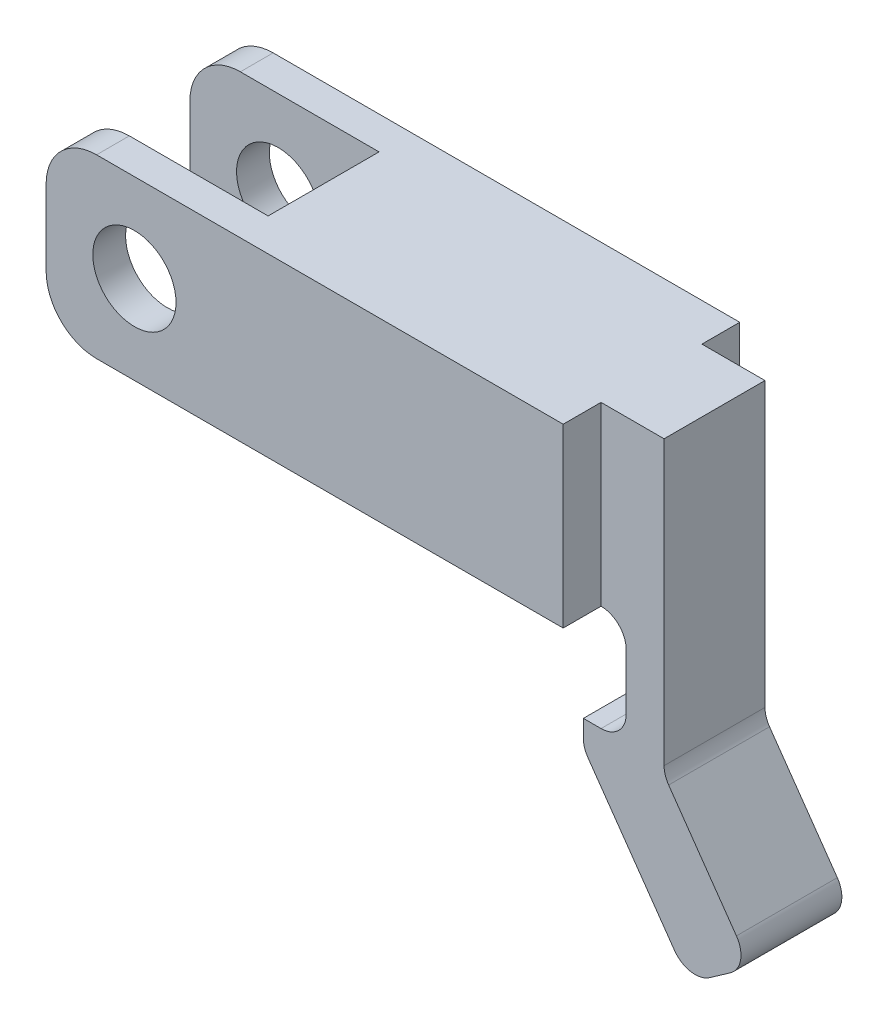
ISO-10303-21;
HEADER;
FILE_DESCRIPTION(('STEP AP214'),'2;1');
FILE_NAME('part.step','',(''),(''),'','','');
FILE_SCHEMA(('AUTOMOTIVE_DESIGN { 1 0 10303 214 1 1 1 1 }'));
ENDSEC;
DATA;
#1=APPLICATION_CONTEXT('core data for automotive mechanical design processes');
#2=APPLICATION_PROTOCOL_DEFINITION('international standard','automotive_design',2000,#1);
#3=PRODUCT_CONTEXT('',#1,'mechanical');
#4=PRODUCT('Part','Part','',(#3));
#5=PRODUCT_RELATED_PRODUCT_CATEGORY('part','',(#4));
#6=PRODUCT_DEFINITION_FORMATION('','',#4);
#7=PRODUCT_DEFINITION_CONTEXT('part definition',#1,'design');
#8=PRODUCT_DEFINITION('design','',#6,#7);
#9=PRODUCT_DEFINITION_SHAPE('','',#8);
#10=(LENGTH_UNIT() NAMED_UNIT(*) SI_UNIT(.MILLI.,.METRE.));
#11=(NAMED_UNIT(*) PLANE_ANGLE_UNIT() SI_UNIT($,.RADIAN.));
#12=(NAMED_UNIT(*) SI_UNIT($,.STERADIAN.) SOLID_ANGLE_UNIT());
#13=UNCERTAINTY_MEASURE_WITH_UNIT(LENGTH_MEASURE(1.E-05),#10,'distance_accuracy_value','');
#14=(GEOMETRIC_REPRESENTATION_CONTEXT(3) GLOBAL_UNCERTAINTY_ASSIGNED_CONTEXT((#13)) GLOBAL_UNIT_ASSIGNED_CONTEXT((#10,
#11,#12)) REPRESENTATION_CONTEXT('',''));
#15=CARTESIAN_POINT('',(0.,0.,0.));
#16=DIRECTION('',(0.,0.,1.));
#17=DIRECTION('',(1.,0.,0.));
#18=AXIS2_PLACEMENT_3D('',#15,#16,#17);
#19=CARTESIAN_POINT('',(6.5,3.5,3.5));
#20=DIRECTION('',(-1.,0.,0.));
#21=DIRECTION('',(0.,0.,1.));
#22=AXIS2_PLACEMENT_3D('',#19,#20,#21);
#23=PLANE('',#22);
#24=DIRECTION('',(0.,-1.,0.));
#25=VECTOR('',#24,1.);
#26=CARTESIAN_POINT('',(6.5,-3.5,2.));
#27=LINE('',#26,#25);
#28=CARTESIAN_POINT('',(6.5,3.5,2.));
#29=VERTEX_POINT('',#28);
#30=CARTESIAN_POINT('',(6.5,-3.5,2.));
#31=VERTEX_POINT('',#30);
#32=EDGE_CURVE('E283',#29,#31,#27,.T.);
#33=ORIENTED_EDGE('',*,*,#32,.F.);
#34=DIRECTION('',(0.,0.,-1.));
#35=VECTOR('',#34,1.);
#36=CARTESIAN_POINT('',(6.5,3.5,3.5));
#37=LINE('',#36,#35);
#38=CARTESIAN_POINT('',(6.5,3.5,3.5));
#39=VERTEX_POINT('',#38);
#40=EDGE_CURVE('E348',#39,#29,#37,.T.);
#41=ORIENTED_EDGE('',*,*,#40,.F.);
#42=DIRECTION('',(0.,1.,0.));
#43=VECTOR('',#42,1.);
#44=CARTESIAN_POINT('',(6.5,3.5,3.5));
#45=LINE('',#44,#43);
#46=CARTESIAN_POINT('',(6.5,-3.5,3.5));
#47=VERTEX_POINT('',#46);
#48=EDGE_CURVE('E324',#47,#39,#45,.T.);
#49=ORIENTED_EDGE('',*,*,#48,.F.);
#50=DIRECTION('',(0.,0.,-1.));
#51=VECTOR('',#50,1.);
#52=CARTESIAN_POINT('',(6.5,-3.5,3.5));
#53=LINE('',#52,#51);
#54=EDGE_CURVE('E341',#47,#31,#53,.T.);
#55=ORIENTED_EDGE('',*,*,#54,.T.);
#56=EDGE_LOOP('',(#33,#41,#49,#55));
#57=FACE_BOUND('',#56,.T.);
#58=ADVANCED_FACE('F33',(#57),#23,.F.);
#59=CARTESIAN_POINT('',(6.5,3.5,-2.));
#60=VERTEX_POINT('',#59);
#61=CARTESIAN_POINT('',(6.5,3.5,-3.5));
#62=VERTEX_POINT('',#61);
#63=EDGE_CURVE('E347',#60,#62,#37,.T.);
#64=ORIENTED_EDGE('',*,*,#63,.F.);
#65=DIRECTION('',(0.,-1.,0.));
#66=VECTOR('',#65,1.);
#67=CARTESIAN_POINT('',(6.5,-3.5,-2.));
#68=LINE('',#67,#66);
#69=CARTESIAN_POINT('',(6.5,-3.5,-2.));
#70=VERTEX_POINT('',#69);
#71=EDGE_CURVE('E261',#60,#70,#68,.T.);
#72=ORIENTED_EDGE('',*,*,#71,.T.);
#73=CARTESIAN_POINT('',(6.5,-3.5,-3.5));
#74=VERTEX_POINT('',#73);
#75=EDGE_CURVE('E333',#70,#74,#53,.T.);
#76=ORIENTED_EDGE('',*,*,#75,.T.);
#77=DIRECTION('',(0.,1.,0.));
#78=VECTOR('',#77,1.);
#79=CARTESIAN_POINT('',(6.5,3.5,-3.5));
#80=LINE('',#79,#78);
#81=EDGE_CURVE('E321',#74,#62,#80,.T.);
#82=ORIENTED_EDGE('',*,*,#81,.T.);
#83=EDGE_LOOP('',(#64,#72,#76,#82));
#84=FACE_BOUND('',#83,.T.);
#85=ADVANCED_FACE('F498',(#84),#23,.F.);
#86=CARTESIAN_POINT('',(-6.5,3.5,3.5));
#87=DIRECTION('',(0.,-1.,0.));
#88=DIRECTION('',(0.,0.,-1.));
#89=AXIS2_PLACEMENT_3D('',#86,#87,#88);
#90=PLANE('',#89);
#91=DIRECTION('',(-1.,0.,0.));
#92=VECTOR('',#91,1.);
#93=CARTESIAN_POINT('',(-6.5,3.5,2.2));
#94=LINE('',#93,#92);
#95=CARTESIAN_POINT('',(-6.5,3.5,2.2));
#96=VERTEX_POINT('',#95);
#97=CARTESIAN_POINT('',(-12.,3.5,2.2));
#98=VERTEX_POINT('',#97);
#99=EDGE_CURVE('E313',#96,#98,#94,.T.);
#100=ORIENTED_EDGE('',*,*,#99,.T.);
#101=DIRECTION('',(0.,0.,1.));
#102=VECTOR('',#101,1.);
#103=CARTESIAN_POINT('',(-12.,3.5,3.5));
#104=LINE('',#103,#102);
#105=CARTESIAN_POINT('',(-12.,3.5,3.5));
#106=VERTEX_POINT('',#105);
#107=EDGE_CURVE('E394',#98,#106,#104,.T.);
#108=ORIENTED_EDGE('',*,*,#107,.T.);
#109=DIRECTION('',(-1.,0.,0.));
#110=VECTOR('',#109,1.);
#111=CARTESIAN_POINT('',(-6.5,3.5,3.5));
#112=LINE('',#111,#110);
#113=EDGE_CURVE('E327',#39,#106,#112,.T.);
#114=ORIENTED_EDGE('',*,*,#113,.F.);
#115=ORIENTED_EDGE('',*,*,#40,.T.);
#116=DIRECTION('',(-1.,0.,0.));
#117=VECTOR('',#116,1.);
#118=CARTESIAN_POINT('',(6.5,3.5,2.));
#119=LINE('',#118,#117);
#120=CARTESIAN_POINT('',(9.,3.5,2.));
#121=VERTEX_POINT('',#120);
#122=EDGE_CURVE('E258',#121,#29,#119,.T.);
#123=ORIENTED_EDGE('',*,*,#122,.F.);
#124=DIRECTION('',(0.,0.,-1.));
#125=VECTOR('',#124,1.);
#126=CARTESIAN_POINT('',(9.,3.5,2.));
#127=LINE('',#126,#125);
#128=CARTESIAN_POINT('',(9.,3.5,-2.));
#129=VERTEX_POINT('',#128);
#130=EDGE_CURVE('E240',#121,#129,#127,.T.);
#131=ORIENTED_EDGE('',*,*,#130,.T.);
#132=DIRECTION('',(-1.,0.,0.));
#133=VECTOR('',#132,1.);
#134=CARTESIAN_POINT('',(6.5,3.5,-2.));
#135=LINE('',#134,#133);
#136=EDGE_CURVE('E280',#129,#60,#135,.T.);
#137=ORIENTED_EDGE('',*,*,#136,.T.);
#138=ORIENTED_EDGE('',*,*,#63,.T.);
#139=DIRECTION('',(-1.,0.,0.));
#140=VECTOR('',#139,1.);
#141=CARTESIAN_POINT('',(-6.5,3.5,-3.5));
#142=LINE('',#141,#140);
#143=CARTESIAN_POINT('',(-12.,3.5,-3.5));
#144=VERTEX_POINT('',#143);
#145=EDGE_CURVE('E336',#62,#144,#142,.T.);
#146=ORIENTED_EDGE('',*,*,#145,.T.);
#147=DIRECTION('',(0.,0.,-1.));
#148=VECTOR('',#147,1.);
#149=CARTESIAN_POINT('',(-12.,3.5,3.5));
#150=LINE('',#149,#148);
#151=CARTESIAN_POINT('',(-12.,3.5,-2.2));
#152=VERTEX_POINT('',#151);
#153=EDGE_CURVE('E392',#144,#152,#150,.F.);
#154=ORIENTED_EDGE('',*,*,#153,.T.);
#155=DIRECTION('',(-1.,0.,0.));
#156=VECTOR('',#155,1.);
#157=CARTESIAN_POINT('',(-6.5,3.5,-2.2));
#158=LINE('',#157,#156);
#159=CARTESIAN_POINT('',(-6.5,3.5,-2.2));
#160=VERTEX_POINT('',#159);
#161=EDGE_CURVE('E299',#160,#152,#158,.T.);
#162=ORIENTED_EDGE('',*,*,#161,.F.);
#163=DIRECTION('',(0.,0.,-1.));
#164=VECTOR('',#163,1.);
#165=CARTESIAN_POINT('',(-6.5,3.5,3.5));
#166=LINE('',#165,#164);
#167=EDGE_CURVE('E344',#96,#160,#166,.T.);
#168=ORIENTED_EDGE('',*,*,#167,.F.);
#169=EDGE_LOOP('',(#100,#108,#114,#115,#123,#131,#137,#138,#146,#154,#162,#168));
#170=FACE_BOUND('',#169,.T.);
#171=ADVANCED_FACE('F459',(#170),#90,.F.);
#172=CARTESIAN_POINT('',(-6.5,3.5,3.5));
#173=DIRECTION('',(1.,0.,0.));
#174=DIRECTION('',(0.,0.,-1.));
#175=AXIS2_PLACEMENT_3D('',#172,#173,#174);
#176=PLANE('',#175);
#177=DIRECTION('',(0.,1.,0.));
#178=VECTOR('',#177,1.);
#179=CARTESIAN_POINT('',(-6.5,3.5,-2.2));
#180=LINE('',#179,#178);
#181=CARTESIAN_POINT('',(-6.5,-2.8,-2.2));
#182=VERTEX_POINT('',#181);
#183=EDGE_CURVE('E292',#182,#160,#180,.T.);
#184=ORIENTED_EDGE('',*,*,#183,.F.);
#185=DIRECTION('',(0.,0.,-1.));
#186=VECTOR('',#185,1.);
#187=CARTESIAN_POINT('',(-6.5,-2.8,3.5));
#188=LINE('',#187,#186);
#189=CARTESIAN_POINT('',(-6.5,-2.8,2.2));
#190=VERTEX_POINT('',#189);
#191=EDGE_CURVE('E354',#182,#190,#188,.F.);
#192=ORIENTED_EDGE('',*,*,#191,.T.);
#193=DIRECTION('',(0.,1.,0.));
#194=VECTOR('',#193,1.);
#195=CARTESIAN_POINT('',(-6.5,3.5,2.2));
#196=LINE('',#195,#194);
#197=EDGE_CURVE('E311',#190,#96,#196,.T.);
#198=ORIENTED_EDGE('',*,*,#197,.T.);
#199=ORIENTED_EDGE('',*,*,#167,.T.);
#200=EDGE_LOOP('',(#184,#192,#198,#199));
#201=FACE_BOUND('',#200,.T.);
#202=ADVANCED_FACE('F641',(#201),#176,.F.);
#203=CARTESIAN_POINT('',(-6.5,-3.5,3.5));
#204=DIRECTION('',(0.,1.,0.));
#205=DIRECTION('',(0.,0.,1.));
#206=AXIS2_PLACEMENT_3D('',#203,#204,#205);
#207=PLANE('',#206);
#208=ORIENTED_EDGE('',*,*,#75,.F.);
#209=DIRECTION('',(0.,0.,-1.));
#210=VECTOR('',#209,1.);
#211=CARTESIAN_POINT('',(6.5,-3.5,2.));
#212=LINE('',#211,#210);
#213=EDGE_CURVE('E402',#70,#31,#212,.F.);
#214=ORIENTED_EDGE('',*,*,#213,.T.);
#215=ORIENTED_EDGE('',*,*,#54,.F.);
#216=DIRECTION('',(1.,0.,0.));
#217=VECTOR('',#216,1.);
#218=CARTESIAN_POINT('',(-6.5,-3.5,3.5));
#219=LINE('',#218,#217);
#220=CARTESIAN_POINT('',(-12.,-3.5,3.5));
#221=VERTEX_POINT('',#220);
#222=EDGE_CURVE('E331',#221,#47,#219,.T.);
#223=ORIENTED_EDGE('',*,*,#222,.F.);
#224=DIRECTION('',(0.,0.,1.));
#225=VECTOR('',#224,1.);
#226=CARTESIAN_POINT('',(-12.,-3.5,2.2));
#227=LINE('',#226,#225);
#228=CARTESIAN_POINT('',(-12.,-3.5,2.2));
#229=VERTEX_POINT('',#228);
#230=EDGE_CURVE('E373',#221,#229,#227,.F.);
#231=ORIENTED_EDGE('',*,*,#230,.T.);
#232=DIRECTION('',(1.,0.,0.));
#233=VECTOR('',#232,1.);
#234=CARTESIAN_POINT('',(-6.5,-3.5,2.2));
#235=LINE('',#234,#233);
#236=CARTESIAN_POINT('',(-5.8,-3.5,2.2));
#237=VERTEX_POINT('',#236);
#238=EDGE_CURVE('E319',#229,#237,#235,.T.);
#239=ORIENTED_EDGE('',*,*,#238,.T.);
#240=DIRECTION('',(0.,0.,-1.));
#241=VECTOR('',#240,1.);
#242=CARTESIAN_POINT('',(-5.8,-3.5,3.5));
#243=LINE('',#242,#241);
#244=CARTESIAN_POINT('',(-5.8,-3.5,-2.2));
#245=VERTEX_POINT('',#244);
#246=EDGE_CURVE('E351',#237,#245,#243,.T.);
#247=ORIENTED_EDGE('',*,*,#246,.T.);
#248=DIRECTION('',(1.,0.,0.));
#249=VECTOR('',#248,1.);
#250=CARTESIAN_POINT('',(-6.5,-3.5,-2.2));
#251=LINE('',#250,#249);
#252=CARTESIAN_POINT('',(-12.,-3.5,-2.2));
#253=VERTEX_POINT('',#252);
#254=EDGE_CURVE('E294',#253,#245,#251,.T.);
#255=ORIENTED_EDGE('',*,*,#254,.F.);
#256=DIRECTION('',(0.,0.,-1.));
#257=VECTOR('',#256,1.);
#258=CARTESIAN_POINT('',(-12.,-3.5,3.5));
#259=LINE('',#258,#257);
#260=CARTESIAN_POINT('',(-12.,-3.5,-3.5));
#261=VERTEX_POINT('',#260);
#262=EDGE_CURVE('E370',#253,#261,#259,.T.);
#263=ORIENTED_EDGE('',*,*,#262,.T.);
#264=DIRECTION('',(1.,0.,0.));
#265=VECTOR('',#264,1.);
#266=CARTESIAN_POINT('',(-6.5,-3.5,-3.5));
#267=LINE('',#266,#265);
#268=EDGE_CURVE('E328',#261,#74,#267,.T.);
#269=ORIENTED_EDGE('',*,*,#268,.T.);
#270=EDGE_LOOP('',(#208,#214,#215,#223,#231,#239,#247,#255,#263,#269));
#271=FACE_BOUND('',#270,.T.);
#272=ADVANCED_FACE('F634',(#271),#207,.F.);
#273=CARTESIAN_POINT('',(0.,0.,3.5));
#274=DIRECTION('',(0.,0.,1.));
#275=DIRECTION('',(1.,0.,0.));
#276=AXIS2_PLACEMENT_3D('',#273,#274,#275);
#277=PLANE('',#276);
#278=CARTESIAN_POINT('',(-10.5,0.,3.5));
#279=DIRECTION('',(0.,0.,1.));
#280=DIRECTION('',(1.,0.,0.));
#281=AXIS2_PLACEMENT_3D('',#278,#279,#280);
#282=CIRCLE('',#281,1.65);
#283=CARTESIAN_POINT('',(-8.85,0.,3.5));
#284=VERTEX_POINT('',#283);
#285=EDGE_CURVE('E305',#284,#284,#282,.T.);
#286=ORIENTED_EDGE('',*,*,#285,.F.);
#287=EDGE_LOOP('',(#286));
#288=FACE_BOUND('',#287,.T.);
#289=DIRECTION('',(0.,-1.,0.));
#290=VECTOR('',#289,1.);
#291=CARTESIAN_POINT('',(-14.,3.5,3.5));
#292=LINE('',#291,#290);
#293=CARTESIAN_POINT('',(-14.,1.5,3.5));
#294=VERTEX_POINT('',#293);
#295=CARTESIAN_POINT('',(-14.,-1.5,3.5));
#296=VERTEX_POINT('',#295);
#297=EDGE_CURVE('E308',#294,#296,#292,.T.);
#298=ORIENTED_EDGE('',*,*,#297,.T.);
#299=CARTESIAN_POINT('',(-12.,-1.5,3.5));
#300=DIRECTION('',(0.,0.,1.));
#301=DIRECTION('',(1.,0.,0.));
#302=AXIS2_PLACEMENT_3D('',#299,#300,#301);
#303=CIRCLE('',#302,2.);
#304=EDGE_CURVE('E368',#296,#221,#303,.T.);
#305=ORIENTED_EDGE('',*,*,#304,.T.);
#306=ORIENTED_EDGE('',*,*,#222,.T.);
#307=ORIENTED_EDGE('',*,*,#48,.T.);
#308=ORIENTED_EDGE('',*,*,#113,.T.);
#309=CARTESIAN_POINT('',(-12.,1.5,3.5));
#310=DIRECTION('',(0.,0.,1.));
#311=DIRECTION('',(1.,0.,0.));
#312=AXIS2_PLACEMENT_3D('',#309,#310,#311);
#313=CIRCLE('',#312,2.);
#314=EDGE_CURVE('E366',#106,#294,#313,.T.);
#315=ORIENTED_EDGE('',*,*,#314,.T.);
#316=EDGE_LOOP('',(#298,#305,#306,#307,#308,#315));
#317=FACE_BOUND('',#316,.T.);
#318=ADVANCED_FACE('F640',(#288,#317),#277,.T.);
#319=CARTESIAN_POINT('',(0.,0.,-3.5));
#320=DIRECTION('',(0.,0.,1.));
#321=DIRECTION('',(1.,0.,0.));
#322=AXIS2_PLACEMENT_3D('',#319,#320,#321);
#323=PLANE('',#322);
#324=CARTESIAN_POINT('',(-10.5,0.,-3.5));
#325=DIRECTION('',(0.,0.,1.));
#326=DIRECTION('',(1.,0.,0.));
#327=AXIS2_PLACEMENT_3D('',#324,#325,#326);
#328=CIRCLE('',#327,1.65);
#329=CARTESIAN_POINT('',(-8.85,0.,-3.5));
#330=VERTEX_POINT('',#329);
#331=EDGE_CURVE('E239',#330,#330,#328,.T.);
#332=ORIENTED_EDGE('',*,*,#331,.T.);
#333=EDGE_LOOP('',(#332));
#334=FACE_BOUND('',#333,.T.);
#335=ORIENTED_EDGE('',*,*,#268,.F.);
#336=CARTESIAN_POINT('',(-12.,-1.5,-3.5));
#337=DIRECTION('',(0.,0.,1.));
#338=DIRECTION('',(1.,0.,0.));
#339=AXIS2_PLACEMENT_3D('',#336,#337,#338);
#340=CIRCLE('',#339,2.);
#341=CARTESIAN_POINT('',(-14.,-1.5,-3.5));
#342=VERTEX_POINT('',#341);
#343=EDGE_CURVE('E381',#261,#342,#340,.F.);
#344=ORIENTED_EDGE('',*,*,#343,.T.);
#345=DIRECTION('',(0.,-1.,0.));
#346=VECTOR('',#345,1.);
#347=CARTESIAN_POINT('',(-14.,3.5,-3.5));
#348=LINE('',#347,#346);
#349=CARTESIAN_POINT('',(-14.,1.5,-3.5));
#350=VERTEX_POINT('',#349);
#351=EDGE_CURVE('E291',#350,#342,#348,.T.);
#352=ORIENTED_EDGE('',*,*,#351,.F.);
#353=CARTESIAN_POINT('',(-12.,1.5,-3.5));
#354=DIRECTION('',(0.,0.,1.));
#355=DIRECTION('',(1.,0.,0.));
#356=AXIS2_PLACEMENT_3D('',#353,#354,#355);
#357=CIRCLE('',#356,2.);
#358=EDGE_CURVE('E379',#350,#144,#357,.F.);
#359=ORIENTED_EDGE('',*,*,#358,.T.);
#360=ORIENTED_EDGE('',*,*,#145,.F.);
#361=ORIENTED_EDGE('',*,*,#81,.F.);
#362=EDGE_LOOP('',(#335,#344,#352,#359,#360,#361));
#363=FACE_BOUND('',#362,.T.);
#364=ADVANCED_FACE('F720',(#334,#363),#323,.F.);
#365=CARTESIAN_POINT('',(-14.,3.5,2.2));
#366=DIRECTION('',(-1.,0.,0.));
#367=DIRECTION('',(0.,0.,1.));
#368=AXIS2_PLACEMENT_3D('',#365,#366,#367);
#369=PLANE('',#368);
#370=DIRECTION('',(0.,-1.,0.));
#371=VECTOR('',#370,1.);
#372=CARTESIAN_POINT('',(-14.,3.5,2.2));
#373=LINE('',#372,#371);
#374=CARTESIAN_POINT('',(-14.,1.5,2.2));
#375=VERTEX_POINT('',#374);
#376=CARTESIAN_POINT('',(-14.,-1.5,2.2));
#377=VERTEX_POINT('',#376);
#378=EDGE_CURVE('E316',#375,#377,#373,.T.);
#379=ORIENTED_EDGE('',*,*,#378,.T.);
#380=DIRECTION('',(0.,0.,1.));
#381=VECTOR('',#380,1.);
#382=CARTESIAN_POINT('',(-14.,-1.5,3.5));
#383=LINE('',#382,#381);
#384=EDGE_CURVE('E363',#377,#296,#383,.T.);
#385=ORIENTED_EDGE('',*,*,#384,.T.);
#386=ORIENTED_EDGE('',*,*,#297,.F.);
#387=DIRECTION('',(0.,0.,1.));
#388=VECTOR('',#387,1.);
#389=CARTESIAN_POINT('',(-14.,1.5,2.2));
#390=LINE('',#389,#388);
#391=EDGE_CURVE('E361',#294,#375,#390,.F.);
#392=ORIENTED_EDGE('',*,*,#391,.T.);
#393=EDGE_LOOP('',(#379,#385,#386,#392));
#394=FACE_BOUND('',#393,.T.);
#395=ADVANCED_FACE('F726',(#394),#369,.T.);
#396=CARTESIAN_POINT('',(0.,0.,2.2));
#397=DIRECTION('',(0.,0.,-1.));
#398=DIRECTION('',(-1.,0.,0.));
#399=AXIS2_PLACEMENT_3D('',#396,#397,#398);
#400=PLANE('',#399);
#401=CARTESIAN_POINT('',(-10.5,0.,2.2));
#402=DIRECTION('',(0.,0.,-1.));
#403=DIRECTION('',(-1.,0.,0.));
#404=AXIS2_PLACEMENT_3D('',#401,#402,#403);
#405=CIRCLE('',#404,1.65);
#406=CARTESIAN_POINT('',(-12.15,0.,2.2));
#407=VERTEX_POINT('',#406);
#408=EDGE_CURVE('E302',#407,#407,#405,.F.);
#409=ORIENTED_EDGE('',*,*,#408,.T.);
#410=EDGE_LOOP('',(#409));
#411=FACE_BOUND('',#410,.T.);
#412=ORIENTED_EDGE('',*,*,#238,.F.);
#413=CARTESIAN_POINT('',(-12.,-1.5,2.2));
#414=DIRECTION('',(0.,0.,-1.));
#415=DIRECTION('',(-1.,0.,0.));
#416=AXIS2_PLACEMENT_3D('',#413,#414,#415);
#417=CIRCLE('',#416,2.);
#418=EDGE_CURVE('E377',#229,#377,#417,.T.);
#419=ORIENTED_EDGE('',*,*,#418,.T.);
#420=ORIENTED_EDGE('',*,*,#378,.F.);
#421=CARTESIAN_POINT('',(-12.,1.5,2.2));
#422=DIRECTION('',(0.,0.,-1.));
#423=DIRECTION('',(-1.,0.,0.));
#424=AXIS2_PLACEMENT_3D('',#421,#422,#423);
#425=CIRCLE('',#424,2.);
#426=EDGE_CURVE('E375',#375,#98,#425,.T.);
#427=ORIENTED_EDGE('',*,*,#426,.T.);
#428=ORIENTED_EDGE('',*,*,#99,.F.);
#429=ORIENTED_EDGE('',*,*,#197,.F.);
#430=CARTESIAN_POINT('',(-5.8,-2.8,2.2));
#431=DIRECTION('',(0.,0.,-1.));
#432=DIRECTION('',(-1.,0.,0.));
#433=AXIS2_PLACEMENT_3D('',#430,#431,#432);
#434=CIRCLE('',#433,0.7);
#435=EDGE_CURVE('E358',#190,#237,#434,.F.);
#436=ORIENTED_EDGE('',*,*,#435,.T.);
#437=EDGE_LOOP('',(#412,#419,#420,#427,#428,#429,#436));
#438=FACE_BOUND('',#437,.T.);
#439=ADVANCED_FACE('F741',(#411,#438),#400,.T.);
#440=CARTESIAN_POINT('',(-10.5,0.,-3.501));
#441=DIRECTION('',(0.,0.,1.));
#442=DIRECTION('',(1.,0.,0.));
#443=AXIS2_PLACEMENT_3D('',#440,#441,#442);
#444=CYLINDRICAL_SURFACE('',#443,1.65);
#445=ORIENTED_EDGE('',*,*,#408,.F.);
#446=EDGE_LOOP('',(#445));
#447=FACE_BOUND('',#446,.T.);
#448=ORIENTED_EDGE('',*,*,#285,.T.);
#449=EDGE_LOOP('',(#448));
#450=FACE_BOUND('',#449,.T.);
#451=ADVANCED_FACE('F715',(#447,#450),#444,.F.);
#452=CARTESIAN_POINT('',(-14.,3.5,-2.2));
#453=DIRECTION('',(1.,0.,0.));
#454=DIRECTION('',(0.,0.,-1.));
#455=AXIS2_PLACEMENT_3D('',#452,#453,#454);
#456=PLANE('',#455);
#457=ORIENTED_EDGE('',*,*,#351,.T.);
#458=DIRECTION('',(0.,0.,-1.));
#459=VECTOR('',#458,1.);
#460=CARTESIAN_POINT('',(-14.,-1.5,-2.2));
#461=LINE('',#460,#459);
#462=CARTESIAN_POINT('',(-14.,-1.5,-2.2));
#463=VERTEX_POINT('',#462);
#464=EDGE_CURVE('E386',#342,#463,#461,.F.);
#465=ORIENTED_EDGE('',*,*,#464,.T.);
#466=DIRECTION('',(0.,-1.,0.));
#467=VECTOR('',#466,1.);
#468=CARTESIAN_POINT('',(-14.,3.5,-2.2));
#469=LINE('',#468,#467);
#470=CARTESIAN_POINT('',(-14.,1.5,-2.2));
#471=VERTEX_POINT('',#470);
#472=EDGE_CURVE('E296',#471,#463,#469,.T.);
#473=ORIENTED_EDGE('',*,*,#472,.F.);
#474=DIRECTION('',(0.,0.,-1.));
#475=VECTOR('',#474,1.);
#476=CARTESIAN_POINT('',(-14.,1.5,-2.2));
#477=LINE('',#476,#475);
#478=EDGE_CURVE('E383',#471,#350,#477,.T.);
#479=ORIENTED_EDGE('',*,*,#478,.T.);
#480=EDGE_LOOP('',(#457,#465,#473,#479));
#481=FACE_BOUND('',#480,.T.);
#482=ADVANCED_FACE('F707',(#481),#456,.F.);
#483=CARTESIAN_POINT('',(0.,0.,-2.2));
#484=DIRECTION('',(0.,0.,1.));
#485=DIRECTION('',(-1.,0.,0.));
#486=AXIS2_PLACEMENT_3D('',#483,#484,#485);
#487=PLANE('',#486);
#488=CARTESIAN_POINT('',(-10.5,0.,-2.2));
#489=DIRECTION('',(0.,0.,1.));
#490=DIRECTION('',(1.,0.,0.));
#491=AXIS2_PLACEMENT_3D('',#488,#489,#490);
#492=CIRCLE('',#491,1.65);
#493=CARTESIAN_POINT('',(-8.85,0.,-2.2));
#494=VERTEX_POINT('',#493);
#495=EDGE_CURVE('E288',#494,#494,#492,.T.);
#496=ORIENTED_EDGE('',*,*,#495,.F.);
#497=EDGE_LOOP('',(#496));
#498=FACE_BOUND('',#497,.T.);
#499=ORIENTED_EDGE('',*,*,#472,.T.);
#500=CARTESIAN_POINT('',(-12.,-1.5,-2.2));
#501=DIRECTION('',(0.,0.,1.));
#502=DIRECTION('',(1.,0.,0.));
#503=AXIS2_PLACEMENT_3D('',#500,#501,#502);
#504=CIRCLE('',#503,2.);
#505=EDGE_CURVE('E390',#463,#253,#504,.T.);
#506=ORIENTED_EDGE('',*,*,#505,.T.);
#507=ORIENTED_EDGE('',*,*,#254,.T.);
#508=CARTESIAN_POINT('',(-5.8,-2.8,-2.2));
#509=DIRECTION('',(0.,0.,1.));
#510=DIRECTION('',(1.,0.,0.));
#511=AXIS2_PLACEMENT_3D('',#508,#509,#510);
#512=CIRCLE('',#511,0.7);
#513=EDGE_CURVE('E356',#245,#182,#512,.F.);
#514=ORIENTED_EDGE('',*,*,#513,.T.);
#515=ORIENTED_EDGE('',*,*,#183,.T.);
#516=ORIENTED_EDGE('',*,*,#161,.T.);
#517=CARTESIAN_POINT('',(-12.,1.5,-2.2));
#518=DIRECTION('',(0.,0.,1.));
#519=DIRECTION('',(1.,0.,0.));
#520=AXIS2_PLACEMENT_3D('',#517,#518,#519);
#521=CIRCLE('',#520,2.);
#522=EDGE_CURVE('E388',#152,#471,#521,.T.);
#523=ORIENTED_EDGE('',*,*,#522,.T.);
#524=EDGE_LOOP('',(#499,#506,#507,#514,#515,#516,#523));
#525=FACE_BOUND('',#524,.T.);
#526=ADVANCED_FACE('F698',(#498,#525),#487,.T.);
#527=CARTESIAN_POINT('',(-10.5,0.,3.501));
#528=DIRECTION('',(0.,0.,-1.));
#529=DIRECTION('',(-1.,0.,0.));
#530=AXIS2_PLACEMENT_3D('',#527,#528,#529);
#531=CYLINDRICAL_SURFACE('',#530,1.65);
#532=ORIENTED_EDGE('',*,*,#495,.T.);
#533=EDGE_LOOP('',(#532));
#534=FACE_BOUND('',#533,.T.);
#535=ORIENTED_EDGE('',*,*,#331,.F.);
#536=EDGE_LOOP('',(#535));
#537=FACE_BOUND('',#536,.T.);
#538=ADVANCED_FACE('F511',(#534,#537),#531,.F.);
#539=CARTESIAN_POINT('',(-5.8,-2.8,3.5));
#540=DIRECTION('',(0.,0.,-1.));
#541=DIRECTION('',(-1.,0.,0.));
#542=AXIS2_PLACEMENT_3D('',#539,#540,#541);
#543=CYLINDRICAL_SURFACE('',#542,0.7);
#544=ORIENTED_EDGE('',*,*,#435,.F.);
#545=ORIENTED_EDGE('',*,*,#191,.F.);
#546=ORIENTED_EDGE('',*,*,#513,.F.);
#547=ORIENTED_EDGE('',*,*,#246,.F.);
#548=EDGE_LOOP('',(#544,#545,#546,#547));
#549=FACE_BOUND('',#548,.T.);
#550=ADVANCED_FACE('F507',(#549),#543,.T.);
#551=CARTESIAN_POINT('',(-12.,-1.5,2.2));
#552=DIRECTION('',(0.,0.,-1.));
#553=DIRECTION('',(-1.,0.,0.));
#554=AXIS2_PLACEMENT_3D('',#551,#552,#553);
#555=CYLINDRICAL_SURFACE('',#554,2.);
#556=ORIENTED_EDGE('',*,*,#418,.F.);
#557=ORIENTED_EDGE('',*,*,#230,.F.);
#558=ORIENTED_EDGE('',*,*,#304,.F.);
#559=ORIENTED_EDGE('',*,*,#384,.F.);
#560=EDGE_LOOP('',(#556,#557,#558,#559));
#561=FACE_BOUND('',#560,.T.);
#562=ADVANCED_FACE('F510',(#561),#555,.T.);
#563=CARTESIAN_POINT('',(-12.,-1.5,3.5));
#564=DIRECTION('',(0.,0.,-1.));
#565=DIRECTION('',(-1.,0.,0.));
#566=AXIS2_PLACEMENT_3D('',#563,#564,#565);
#567=CYLINDRICAL_SURFACE('',#566,2.);
#568=ORIENTED_EDGE('',*,*,#505,.F.);
#569=ORIENTED_EDGE('',*,*,#464,.F.);
#570=ORIENTED_EDGE('',*,*,#343,.F.);
#571=ORIENTED_EDGE('',*,*,#262,.F.);
#572=EDGE_LOOP('',(#568,#569,#570,#571));
#573=FACE_BOUND('',#572,.T.);
#574=ADVANCED_FACE('F515',(#573),#567,.T.);
#575=CARTESIAN_POINT('',(-12.,1.5,3.5));
#576=DIRECTION('',(0.,0.,-1.));
#577=DIRECTION('',(-1.,0.,0.));
#578=AXIS2_PLACEMENT_3D('',#575,#576,#577);
#579=CYLINDRICAL_SURFACE('',#578,2.);
#580=ORIENTED_EDGE('',*,*,#426,.F.);
#581=ORIENTED_EDGE('',*,*,#391,.F.);
#582=ORIENTED_EDGE('',*,*,#314,.F.);
#583=ORIENTED_EDGE('',*,*,#107,.F.);
#584=EDGE_LOOP('',(#580,#581,#582,#583));
#585=FACE_BOUND('',#584,.T.);
#586=ADVANCED_FACE('F519',(#585),#579,.T.);
#587=CARTESIAN_POINT('',(-12.,1.5,-2.2));
#588=DIRECTION('',(0.,0.,-1.));
#589=DIRECTION('',(-1.,0.,0.));
#590=AXIS2_PLACEMENT_3D('',#587,#588,#589);
#591=CYLINDRICAL_SURFACE('',#590,2.);
#592=ORIENTED_EDGE('',*,*,#522,.F.);
#593=ORIENTED_EDGE('',*,*,#153,.F.);
#594=ORIENTED_EDGE('',*,*,#358,.F.);
#595=ORIENTED_EDGE('',*,*,#478,.F.);
#596=EDGE_LOOP('',(#592,#593,#594,#595));
#597=FACE_BOUND('',#596,.T.);
#598=ADVANCED_FACE('F523',(#597),#591,.T.);
#599=CARTESIAN_POINT('',(7.5,-7.70000000000002,2.));
#600=DIRECTION('',(1.,0.,0.));
#601=DIRECTION('',(0.,0.,-1.));
#602=AXIS2_PLACEMENT_3D('',#599,#600,#601);
#603=PLANE('',#602);
#604=DIRECTION('',(0.,-1.,0.));
#605=VECTOR('',#604,1.);
#606=CARTESIAN_POINT('',(7.5,-7.70000000000002,2.));
#607=LINE('',#606,#605);
#608=CARTESIAN_POINT('',(7.5,-4.5,2.));
#609=VERTEX_POINT('',#608);
#610=CARTESIAN_POINT('',(7.5,-6.70000000000002,2.));
#611=VERTEX_POINT('',#610);
#612=EDGE_CURVE('E229',#609,#611,#607,.T.);
#613=ORIENTED_EDGE('',*,*,#612,.F.);
#614=DIRECTION('',(0.,0.,-1.));
#615=VECTOR('',#614,1.);
#616=CARTESIAN_POINT('',(7.5,-4.5,-2.));
#617=LINE('',#616,#615);
#618=CARTESIAN_POINT('',(7.5,-4.5,-2.));
#619=VERTEX_POINT('',#618);
#620=EDGE_CURVE('E399',#609,#619,#617,.T.);
#621=ORIENTED_EDGE('',*,*,#620,.T.);
#622=DIRECTION('',(0.,-1.,0.));
#623=VECTOR('',#622,1.);
#624=CARTESIAN_POINT('',(7.5,-7.70000000000002,-2.));
#625=LINE('',#624,#623);
#626=CARTESIAN_POINT('',(7.5,-6.70000000000002,-2.));
#627=VERTEX_POINT('',#626);
#628=EDGE_CURVE('E264',#619,#627,#625,.T.);
#629=ORIENTED_EDGE('',*,*,#628,.T.);
#630=DIRECTION('',(0.,0.,-1.));
#631=VECTOR('',#630,1.);
#632=CARTESIAN_POINT('',(7.5,-6.70000000000002,2.));
#633=LINE('',#632,#631);
#634=EDGE_CURVE('E397',#627,#611,#633,.F.);
#635=ORIENTED_EDGE('',*,*,#634,.T.);
#636=EDGE_LOOP('',(#613,#621,#629,#635));
#637=FACE_BOUND('',#636,.T.);
#638=ADVANCED_FACE('F527',(#637),#603,.F.);
#639=CARTESIAN_POINT('',(5.8,-7.70000000000002,2.));
#640=DIRECTION('',(0.,-1.,0.));
#641=DIRECTION('',(0.,0.,-1.));
#642=AXIS2_PLACEMENT_3D('',#639,#640,#641);
#643=PLANE('',#642);
#644=DIRECTION('',(-1.,0.,0.));
#645=VECTOR('',#644,1.);
#646=CARTESIAN_POINT('',(5.8,-7.70000000000002,2.));
#647=LINE('',#646,#645);
#648=CARTESIAN_POINT('',(6.5,-7.70000000000002,2.));
#649=VERTEX_POINT('',#648);
#650=CARTESIAN_POINT('',(5.8,-7.70000000000002,2.));
#651=VERTEX_POINT('',#650);
#652=EDGE_CURVE('E217',#649,#651,#647,.T.);
#653=ORIENTED_EDGE('',*,*,#652,.F.);
#654=DIRECTION('',(0.,0.,-1.));
#655=VECTOR('',#654,1.);
#656=CARTESIAN_POINT('',(6.5,-7.70000000000002,-2.));
#657=LINE('',#656,#655);
#658=CARTESIAN_POINT('',(6.5,-7.70000000000002,-2.));
#659=VERTEX_POINT('',#658);
#660=EDGE_CURVE('E404',#649,#659,#657,.T.);
#661=ORIENTED_EDGE('',*,*,#660,.T.);
#662=DIRECTION('',(-1.,0.,0.));
#663=VECTOR('',#662,1.);
#664=CARTESIAN_POINT('',(5.8,-7.70000000000002,-2.));
#665=LINE('',#664,#663);
#666=CARTESIAN_POINT('',(5.8,-7.70000000000002,-2.));
#667=VERTEX_POINT('',#666);
#668=EDGE_CURVE('E235',#659,#667,#665,.T.);
#669=ORIENTED_EDGE('',*,*,#668,.T.);
#670=DIRECTION('',(0.,0.,-1.));
#671=VECTOR('',#670,1.);
#672=CARTESIAN_POINT('',(5.8,-7.70000000000002,2.));
#673=LINE('',#672,#671);
#674=EDGE_CURVE('E232',#651,#667,#673,.T.);
#675=ORIENTED_EDGE('',*,*,#674,.F.);
#676=EDGE_LOOP('',(#653,#661,#669,#675));
#677=FACE_BOUND('',#676,.T.);
#678=ADVANCED_FACE('F233',(#677),#643,.F.);
#679=CARTESIAN_POINT('',(5.8,-8.70000000000002,2.));
#680=DIRECTION('',(1.,0.,0.));
#681=DIRECTION('',(0.,0.,-1.));
#682=AXIS2_PLACEMENT_3D('',#679,#680,#681);
#683=PLANE('',#682);
#684=DIRECTION('',(0.,-1.,0.));
#685=VECTOR('',#684,1.);
#686=CARTESIAN_POINT('',(5.8,-8.70000000000002,-2.));
#687=LINE('',#686,#685);
#688=CARTESIAN_POINT('',(5.8,-8.38470121112104,-2.));
#689=VERTEX_POINT('',#688);
#690=EDGE_CURVE('E268',#667,#689,#687,.T.);
#691=ORIENTED_EDGE('',*,*,#690,.T.);
#692=DIRECTION('',(0.,0.,-1.));
#693=VECTOR('',#692,1.);
#694=CARTESIAN_POINT('',(5.8,-8.38470121112104,2.));
#695=LINE('',#694,#693);
#696=CARTESIAN_POINT('',(5.8,-8.38470121112104,2.));
#697=VERTEX_POINT('',#696);
#698=EDGE_CURVE('E244',#689,#697,#695,.F.);
#699=ORIENTED_EDGE('',*,*,#698,.T.);
#700=DIRECTION('',(0.,-1.,0.));
#701=VECTOR('',#700,1.);
#702=CARTESIAN_POINT('',(5.8,-8.70000000000002,2.));
#703=LINE('',#702,#701);
#704=EDGE_CURVE('E221',#651,#697,#703,.T.);
#705=ORIENTED_EDGE('',*,*,#704,.F.);
#706=ORIENTED_EDGE('',*,*,#674,.T.);
#707=EDGE_LOOP('',(#691,#699,#705,#706));
#708=FACE_BOUND('',#707,.T.);
#709=ADVANCED_FACE('F242',(#708),#683,.F.);
#710=CARTESIAN_POINT('',(9.98400248523929,-14.6753748094985,2.));
#711=DIRECTION('',(0.819152044288991,0.573576436351048,0.));
#712=DIRECTION('',(-0.573576436351048,0.819152044288991,0.));
#713=AXIS2_PLACEMENT_3D('',#710,#711,#712);
#714=PLANE('',#713);
#715=DIRECTION('',(0.573576436351048,-0.819152044288991,0.));
#716=VECTOR('',#715,1.);
#717=CARTESIAN_POINT('',(9.98400248523929,-14.6753748094985,2.));
#718=LINE('',#717,#716);
#719=CARTESIAN_POINT('',(5.98084795571101,-8.95827764747208,2.));
#720=VERTEX_POINT('',#719);
#721=CARTESIAN_POINT('',(9.41042604888825,-13.8562227652096,2.));
#722=VERTEX_POINT('',#721);
#723=EDGE_CURVE('E245',#720,#722,#718,.T.);
#724=ORIENTED_EDGE('',*,*,#723,.F.);
#725=DIRECTION('',(0.,0.,-1.));
#726=VECTOR('',#725,1.);
#727=CARTESIAN_POINT('',(5.98084795571101,-8.95827764747208,2.));
#728=LINE('',#727,#726);
#729=CARTESIAN_POINT('',(5.98084795571101,-8.95827764747208,-2.));
#730=VERTEX_POINT('',#729);
#731=EDGE_CURVE('E408',#720,#730,#728,.T.);
#732=ORIENTED_EDGE('',*,*,#731,.T.);
#733=DIRECTION('',(0.573576436351048,-0.819152044288991,0.));
#734=VECTOR('',#733,1.);
#735=CARTESIAN_POINT('',(9.98400248523929,-14.6753748094985,-2.));
#736=LINE('',#735,#734);
#737=CARTESIAN_POINT('',(9.41042604888825,-13.8562227652096,-2.));
#738=VERTEX_POINT('',#737);
#739=EDGE_CURVE('E270',#730,#738,#736,.T.);
#740=ORIENTED_EDGE('',*,*,#739,.T.);
#741=DIRECTION('',(0.,0.,-1.));
#742=VECTOR('',#741,1.);
#743=CARTESIAN_POINT('',(9.41042604888825,-13.8562227652096,2.));
#744=LINE('',#743,#742);
#745=EDGE_CURVE('E406',#738,#722,#744,.F.);
#746=ORIENTED_EDGE('',*,*,#745,.T.);
#747=EDGE_LOOP('',(#724,#732,#740,#746));
#748=FACE_BOUND('',#747,.T.);
#749=ADVANCED_FACE('F478',(#748),#714,.F.);
#750=CARTESIAN_POINT('',(12.4414586181063,-12.9546455004454,2.));
#751=DIRECTION('',(-0.573576436351048,0.819152044288991,0.));
#752=DIRECTION('',(-0.819152044288991,-0.573576436351048,0.));
#753=AXIS2_PLACEMENT_3D('',#750,#751,#752);
#754=PLANE('',#753);
#755=DIRECTION('',(0.819152044288991,0.573576436351048,0.));
#756=VECTOR('',#755,1.);
#757=CARTESIAN_POINT('',(12.4414586181063,-12.9546455004454,2.));
#758=LINE('',#757,#756);
#759=CARTESIAN_POINT('',(10.8031545295283,-14.1017983731475,2.));
#760=VERTEX_POINT('',#759);
#761=CARTESIAN_POINT('',(11.6223065738173,-13.5282219367964,2.));
#762=VERTEX_POINT('',#761);
#763=EDGE_CURVE('E248',#760,#762,#758,.T.);
#764=ORIENTED_EDGE('',*,*,#763,.F.);
#765=DIRECTION('',(0.,0.,-1.));
#766=VECTOR('',#765,1.);
#767=CARTESIAN_POINT('',(10.8031545295283,-14.1017983731475,2.));
#768=LINE('',#767,#766);
#769=CARTESIAN_POINT('',(10.8031545295283,-14.1017983731475,-2.));
#770=VERTEX_POINT('',#769);
#771=EDGE_CURVE('E426',#760,#770,#768,.T.);
#772=ORIENTED_EDGE('',*,*,#771,.T.);
#773=DIRECTION('',(0.819152044288991,0.573576436351048,0.));
#774=VECTOR('',#773,1.);
#775=CARTESIAN_POINT('',(12.4414586181063,-12.9546455004454,-2.));
#776=LINE('',#775,#774);
#777=CARTESIAN_POINT('',(11.6223065738173,-13.5282219367964,-2.));
#778=VERTEX_POINT('',#777);
#779=EDGE_CURVE('E273',#770,#778,#776,.T.);
#780=ORIENTED_EDGE('',*,*,#779,.T.);
#781=DIRECTION('',(0.,0.,-1.));
#782=VECTOR('',#781,1.);
#783=CARTESIAN_POINT('',(11.6223065738173,-13.5282219367964,2.));
#784=LINE('',#783,#782);
#785=EDGE_CURVE('E424',#778,#762,#784,.F.);
#786=ORIENTED_EDGE('',*,*,#785,.T.);
#787=EDGE_LOOP('',(#764,#772,#780,#786));
#788=FACE_BOUND('',#787,.T.);
#789=ADVANCED_FACE('F486',(#788),#754,.F.);
#790=CARTESIAN_POINT('',(9.,-8.03973323471144,2.));
#791=DIRECTION('',(-0.819152044288993,-0.573576436351044,0.));
#792=DIRECTION('',(0.573576436351044,-0.819152044288993,0.));
#793=AXIS2_PLACEMENT_3D('',#790,#791,#792);
#794=PLANE('',#793);
#795=DIRECTION('',(-0.573576436351044,0.819152044288993,0.));
#796=VECTOR('',#795,1.);
#797=CARTESIAN_POINT('',(9.,-8.03973323471144,2.));
#798=LINE('',#797,#796);
#799=CARTESIAN_POINT('',(11.8678821817552,-12.1354934561564,2.));
#800=VERTEX_POINT('',#799);
#801=CARTESIAN_POINT('',(9.18084795571101,-8.29801088218351,2.));
#802=VERTEX_POINT('',#801);
#803=EDGE_CURVE('E254',#800,#802,#798,.T.);
#804=ORIENTED_EDGE('',*,*,#803,.F.);
#805=DIRECTION('',(0.,0.,-1.));
#806=VECTOR('',#805,1.);
#807=CARTESIAN_POINT('',(11.8678821817552,-12.1354934561564,2.));
#808=LINE('',#807,#806);
#809=CARTESIAN_POINT('',(11.8678821817552,-12.1354934561564,-2.));
#810=VERTEX_POINT('',#809);
#811=EDGE_CURVE('E430',#800,#810,#808,.T.);
#812=ORIENTED_EDGE('',*,*,#811,.T.);
#813=DIRECTION('',(-0.573576436351044,0.819152044288993,0.));
#814=VECTOR('',#813,1.);
#815=CARTESIAN_POINT('',(9.,-8.03973323471144,-2.));
#816=LINE('',#815,#814);
#817=CARTESIAN_POINT('',(9.18084795571101,-8.29801088218351,-2.));
#818=VERTEX_POINT('',#817);
#819=EDGE_CURVE('E276',#810,#818,#816,.T.);
#820=ORIENTED_EDGE('',*,*,#819,.T.);
#821=DIRECTION('',(0.,0.,-1.));
#822=VECTOR('',#821,1.);
#823=CARTESIAN_POINT('',(9.18084795571101,-8.29801088218351,2.));
#824=LINE('',#823,#822);
#825=EDGE_CURVE('E54',#818,#802,#824,.F.);
#826=ORIENTED_EDGE('',*,*,#825,.T.);
#827=EDGE_LOOP('',(#804,#812,#820,#826));
#828=FACE_BOUND('',#827,.T.);
#829=ADVANCED_FACE('F450',(#828),#794,.F.);
#830=CARTESIAN_POINT('',(9.,3.5,2.));
#831=DIRECTION('',(-1.,0.,0.));
#832=DIRECTION('',(0.,-1.,0.));
#833=AXIS2_PLACEMENT_3D('',#830,#831,#832);
#834=PLANE('',#833);
#835=DIRECTION('',(0.,1.,0.));
#836=VECTOR('',#835,1.);
#837=CARTESIAN_POINT('',(9.,3.5,2.));
#838=LINE('',#837,#836);
#839=CARTESIAN_POINT('',(9.,-7.72443444583246,2.));
#840=VERTEX_POINT('',#839);
#841=EDGE_CURVE('E256',#840,#121,#838,.T.);
#842=ORIENTED_EDGE('',*,*,#841,.F.);
#843=DIRECTION('',(0.,0.,-1.));
#844=VECTOR('',#843,1.);
#845=CARTESIAN_POINT('',(9.,-7.72443444583246,-2.));
#846=LINE('',#845,#844);
#847=CARTESIAN_POINT('',(9.,-7.72443444583246,-2.));
#848=VERTEX_POINT('',#847);
#849=EDGE_CURVE('E433',#840,#848,#846,.T.);
#850=ORIENTED_EDGE('',*,*,#849,.T.);
#851=DIRECTION('',(0.,1.,0.));
#852=VECTOR('',#851,1.);
#853=CARTESIAN_POINT('',(9.,3.5,-2.));
#854=LINE('',#853,#852);
#855=EDGE_CURVE('E278',#848,#129,#854,.T.);
#856=ORIENTED_EDGE('',*,*,#855,.T.);
#857=ORIENTED_EDGE('',*,*,#130,.F.);
#858=EDGE_LOOP('',(#842,#850,#856,#857));
#859=FACE_BOUND('',#858,.T.);
#860=ADVANCED_FACE('F453',(#859),#834,.F.);
#861=CARTESIAN_POINT('',(0.,0.,2.));
#862=DIRECTION('',(0.,0.,-1.));
#863=DIRECTION('',(-1.,0.,0.));
#864=AXIS2_PLACEMENT_3D('',#861,#862,#863);
#865=PLANE('',#864);
#866=ORIENTED_EDGE('',*,*,#704,.T.);
#867=CARTESIAN_POINT('',(6.8,-8.38470121112104,2.));
#868=DIRECTION('',(0.,0.,-1.));
#869=DIRECTION('',(-1.,0.,0.));
#870=AXIS2_PLACEMENT_3D('',#867,#868,#869);
#871=CIRCLE('',#870,1.);
#872=EDGE_CURVE('E422',#697,#720,#871,.F.);
#873=ORIENTED_EDGE('',*,*,#872,.T.);
#874=ORIENTED_EDGE('',*,*,#723,.T.);
#875=CARTESIAN_POINT('',(10.2295780931772,-13.2826463288585,2.));
#876=DIRECTION('',(0.,0.,-1.));
#877=DIRECTION('',(-1.,0.,0.));
#878=AXIS2_PLACEMENT_3D('',#875,#876,#877);
#879=CIRCLE('',#878,1.);
#880=EDGE_CURVE('E420',#722,#760,#879,.F.);
#881=ORIENTED_EDGE('',*,*,#880,.T.);
#882=ORIENTED_EDGE('',*,*,#763,.T.);
#883=CARTESIAN_POINT('',(11.0487301374662,-12.7090698925075,2.));
#884=DIRECTION('',(0.,0.,-1.));
#885=DIRECTION('',(-1.,0.,0.));
#886=AXIS2_PLACEMENT_3D('',#883,#884,#885);
#887=CIRCLE('',#886,1.);
#888=EDGE_CURVE('E418',#762,#800,#887,.F.);
#889=ORIENTED_EDGE('',*,*,#888,.T.);
#890=ORIENTED_EDGE('',*,*,#803,.T.);
#891=CARTESIAN_POINT('',(10.,-7.72443444583246,2.));
#892=DIRECTION('',(0.,0.,-1.));
#893=DIRECTION('',(-1.,0.,0.));
#894=AXIS2_PLACEMENT_3D('',#891,#892,#893);
#895=CIRCLE('',#894,1.);
#896=EDGE_CURVE('E11',#802,#840,#895,.T.);
#897=ORIENTED_EDGE('',*,*,#896,.T.);
#898=ORIENTED_EDGE('',*,*,#841,.T.);
#899=ORIENTED_EDGE('',*,*,#122,.T.);
#900=ORIENTED_EDGE('',*,*,#32,.T.);
#901=CARTESIAN_POINT('',(6.5,-4.5,2.));
#902=DIRECTION('',(0.,0.,-1.));
#903=DIRECTION('',(-1.,0.,0.));
#904=AXIS2_PLACEMENT_3D('',#901,#902,#903);
#905=CIRCLE('',#904,1.);
#906=EDGE_CURVE('E438',#31,#609,#905,.T.);
#907=ORIENTED_EDGE('',*,*,#906,.T.);
#908=ORIENTED_EDGE('',*,*,#612,.T.);
#909=CARTESIAN_POINT('',(6.5,-6.70000000000002,2.));
#910=DIRECTION('',(0.,0.,-1.));
#911=DIRECTION('',(-1.,0.,0.));
#912=AXIS2_PLACEMENT_3D('',#909,#910,#911);
#913=CIRCLE('',#912,1.);
#914=EDGE_CURVE('E225',#611,#649,#913,.T.);
#915=ORIENTED_EDGE('',*,*,#914,.T.);
#916=ORIENTED_EDGE('',*,*,#652,.T.);
#917=EDGE_LOOP('',(#866,#873,#874,#881,#882,#889,#890,#897,#898,#899,#900,#907,#908,#915,#916));
#918=FACE_BOUND('',#917,.T.);
#919=ADVANCED_FACE('F219',(#918),#865,.F.);
#920=CARTESIAN_POINT('',(0.,0.,-2.));
#921=DIRECTION('',(0.,0.,-1.));
#922=DIRECTION('',(-1.,0.,0.));
#923=AXIS2_PLACEMENT_3D('',#920,#921,#922);
#924=PLANE('',#923);
#925=ORIENTED_EDGE('',*,*,#739,.F.);
#926=CARTESIAN_POINT('',(6.8,-8.38470121112104,-2.));
#927=DIRECTION('',(0.,0.,-1.));
#928=DIRECTION('',(-1.,0.,0.));
#929=AXIS2_PLACEMENT_3D('',#926,#927,#928);
#930=CIRCLE('',#929,1.);
#931=EDGE_CURVE('E415',#730,#689,#930,.T.);
#932=ORIENTED_EDGE('',*,*,#931,.T.);
#933=ORIENTED_EDGE('',*,*,#690,.F.);
#934=ORIENTED_EDGE('',*,*,#668,.F.);
#935=CARTESIAN_POINT('',(6.5,-6.70000000000002,-2.));
#936=DIRECTION('',(0.,0.,-1.));
#937=DIRECTION('',(-1.,0.,0.));
#938=AXIS2_PLACEMENT_3D('',#935,#936,#937);
#939=CIRCLE('',#938,1.);
#940=EDGE_CURVE('E440',#659,#627,#939,.F.);
#941=ORIENTED_EDGE('',*,*,#940,.T.);
#942=ORIENTED_EDGE('',*,*,#628,.F.);
#943=CARTESIAN_POINT('',(6.5,-4.5,-2.));
#944=DIRECTION('',(0.,0.,-1.));
#945=DIRECTION('',(-1.,0.,0.));
#946=AXIS2_PLACEMENT_3D('',#943,#944,#945);
#947=CIRCLE('',#946,1.);
#948=EDGE_CURVE('E436',#619,#70,#947,.F.);
#949=ORIENTED_EDGE('',*,*,#948,.T.);
#950=ORIENTED_EDGE('',*,*,#71,.F.);
#951=ORIENTED_EDGE('',*,*,#136,.F.);
#952=ORIENTED_EDGE('',*,*,#855,.F.);
#953=CARTESIAN_POINT('',(10.,-7.72443444583246,-2.));
#954=DIRECTION('',(0.,0.,-1.));
#955=DIRECTION('',(-1.,0.,0.));
#956=AXIS2_PLACEMENT_3D('',#953,#954,#955);
#957=CIRCLE('',#956,1.);
#958=EDGE_CURVE('E41',#848,#818,#957,.F.);
#959=ORIENTED_EDGE('',*,*,#958,.T.);
#960=ORIENTED_EDGE('',*,*,#819,.F.);
#961=CARTESIAN_POINT('',(11.0487301374662,-12.7090698925075,-2.));
#962=DIRECTION('',(0.,0.,-1.));
#963=DIRECTION('',(-1.,0.,0.));
#964=AXIS2_PLACEMENT_3D('',#961,#962,#963);
#965=CIRCLE('',#964,1.);
#966=EDGE_CURVE('E411',#810,#778,#965,.T.);
#967=ORIENTED_EDGE('',*,*,#966,.T.);
#968=ORIENTED_EDGE('',*,*,#779,.F.);
#969=CARTESIAN_POINT('',(10.2295780931772,-13.2826463288585,-2.));
#970=DIRECTION('',(0.,0.,-1.));
#971=DIRECTION('',(-1.,0.,0.));
#972=AXIS2_PLACEMENT_3D('',#969,#970,#971);
#973=CIRCLE('',#972,1.);
#974=EDGE_CURVE('E413',#770,#738,#973,.T.);
#975=ORIENTED_EDGE('',*,*,#974,.T.);
#976=EDGE_LOOP('',(#925,#932,#933,#934,#941,#942,#949,#950,#951,#952,#959,#960,#967,#968,#975));
#977=FACE_BOUND('',#976,.T.);
#978=ADVANCED_FACE('F446',(#977),#924,.T.);
#979=CARTESIAN_POINT('',(6.5,-4.5,2.));
#980=DIRECTION('',(0.,0.,1.));
#981=DIRECTION('',(1.,0.,0.));
#982=AXIS2_PLACEMENT_3D('',#979,#980,#981);
#983=CYLINDRICAL_SURFACE('',#982,1.);
#984=ORIENTED_EDGE('',*,*,#906,.F.);
#985=ORIENTED_EDGE('',*,*,#213,.F.);
#986=ORIENTED_EDGE('',*,*,#948,.F.);
#987=ORIENTED_EDGE('',*,*,#620,.F.);
#988=EDGE_LOOP('',(#984,#985,#986,#987));
#989=FACE_BOUND('',#988,.T.);
#990=ADVANCED_FACE('F529',(#989),#983,.F.);
#991=CARTESIAN_POINT('',(6.5,-6.70000000000002,2.));
#992=DIRECTION('',(0.,0.,1.));
#993=DIRECTION('',(1.,0.,0.));
#994=AXIS2_PLACEMENT_3D('',#991,#992,#993);
#995=CYLINDRICAL_SURFACE('',#994,1.);
#996=ORIENTED_EDGE('',*,*,#914,.F.);
#997=ORIENTED_EDGE('',*,*,#634,.F.);
#998=ORIENTED_EDGE('',*,*,#940,.F.);
#999=ORIENTED_EDGE('',*,*,#660,.F.);
#1000=EDGE_LOOP('',(#996,#997,#998,#999));
#1001=FACE_BOUND('',#1000,.T.);
#1002=ADVANCED_FACE('F470',(#1001),#995,.F.);
#1003=CARTESIAN_POINT('',(6.8,-8.38470121112104,2.));
#1004=DIRECTION('',(0.,0.,-1.));
#1005=DIRECTION('',(-1.,0.,0.));
#1006=AXIS2_PLACEMENT_3D('',#1003,#1004,#1005);
#1007=CYLINDRICAL_SURFACE('',#1006,1.);
#1008=ORIENTED_EDGE('',*,*,#872,.F.);
#1009=ORIENTED_EDGE('',*,*,#698,.F.);
#1010=ORIENTED_EDGE('',*,*,#931,.F.);
#1011=ORIENTED_EDGE('',*,*,#731,.F.);
#1012=EDGE_LOOP('',(#1008,#1009,#1010,#1011));
#1013=FACE_BOUND('',#1012,.T.);
#1014=ADVANCED_FACE('F473',(#1013),#1007,.T.);
#1015=CARTESIAN_POINT('',(10.2295780931772,-13.2826463288585,2.));
#1016=DIRECTION('',(0.,0.,-1.));
#1017=DIRECTION('',(-1.,0.,0.));
#1018=AXIS2_PLACEMENT_3D('',#1015,#1016,#1017);
#1019=CYLINDRICAL_SURFACE('',#1018,1.);
#1020=ORIENTED_EDGE('',*,*,#880,.F.);
#1021=ORIENTED_EDGE('',*,*,#745,.F.);
#1022=ORIENTED_EDGE('',*,*,#974,.F.);
#1023=ORIENTED_EDGE('',*,*,#771,.F.);
#1024=EDGE_LOOP('',(#1020,#1021,#1022,#1023));
#1025=FACE_BOUND('',#1024,.T.);
#1026=ADVANCED_FACE('F481',(#1025),#1019,.T.);
#1027=CARTESIAN_POINT('',(11.0487301374662,-12.7090698925075,2.));
#1028=DIRECTION('',(0.,0.,-1.));
#1029=DIRECTION('',(-1.,0.,0.));
#1030=AXIS2_PLACEMENT_3D('',#1027,#1028,#1029);
#1031=CYLINDRICAL_SURFACE('',#1030,1.);
#1032=ORIENTED_EDGE('',*,*,#888,.F.);
#1033=ORIENTED_EDGE('',*,*,#785,.F.);
#1034=ORIENTED_EDGE('',*,*,#966,.F.);
#1035=ORIENTED_EDGE('',*,*,#811,.F.);
#1036=EDGE_LOOP('',(#1032,#1033,#1034,#1035));
#1037=FACE_BOUND('',#1036,.T.);
#1038=ADVANCED_FACE('F490',(#1037),#1031,.T.);
#1039=CARTESIAN_POINT('',(10.,-7.72443444583246,2.));
#1040=DIRECTION('',(0.,0.,1.));
#1041=DIRECTION('',(1.,0.,0.));
#1042=AXIS2_PLACEMENT_3D('',#1039,#1040,#1041);
#1043=CYLINDRICAL_SURFACE('',#1042,1.);
#1044=ORIENTED_EDGE('',*,*,#896,.F.);
#1045=ORIENTED_EDGE('',*,*,#825,.F.);
#1046=ORIENTED_EDGE('',*,*,#958,.F.);
#1047=ORIENTED_EDGE('',*,*,#849,.F.);
#1048=EDGE_LOOP('',(#1044,#1045,#1046,#1047));
#1049=FACE_BOUND('',#1048,.T.);
#1050=ADVANCED_FACE('F35',(#1049),#1043,.F.);
#1051=CLOSED_SHELL('',(#58,#85,#171,#202,#272,#318,#364,#395,#439,#451,#482,#526,#538,#550,#562,
#574,#586,#598,#638,#678,#709,#749,#789,#829,#860,#919,#978,#990,#1002,#1014,#1026,#1038,#1050));
#1052=MANIFOLD_SOLID_BREP('B2',#1051);
#1053=ADVANCED_BREP_SHAPE_REPRESENTATION('',(#18,#1052),#14);
#1054=SHAPE_DEFINITION_REPRESENTATION(#9,#1053);
ENDSEC;
END-ISO-10303-21;
